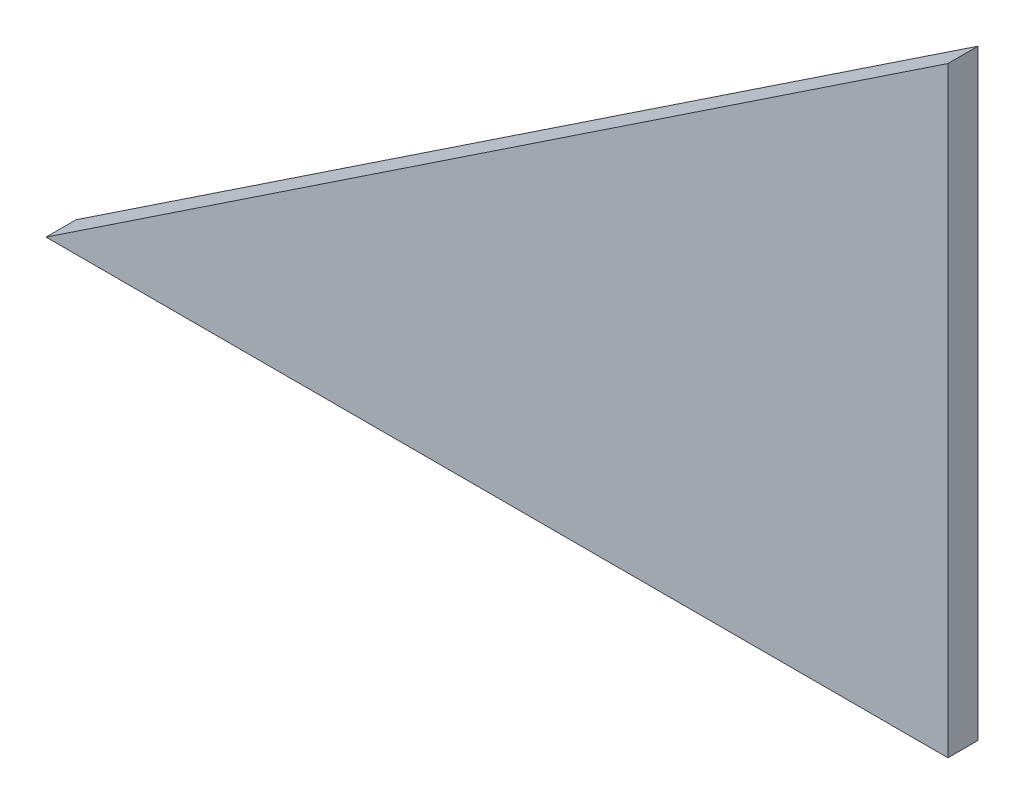
ISO-10303-21;
HEADER;
FILE_DESCRIPTION(('STEP AP214'),'2;1');
FILE_NAME('part.step','',(''),(''),'','','');
FILE_SCHEMA(('AUTOMOTIVE_DESIGN { 1 0 10303 214 1 1 1 1 }'));
ENDSEC;
DATA;
#1=APPLICATION_CONTEXT('core data for automotive mechanical design processes');
#2=APPLICATION_PROTOCOL_DEFINITION('international standard','automotive_design',2000,#1);
#3=PRODUCT_CONTEXT('',#1,'mechanical');
#4=PRODUCT('Part','Part','',(#3));
#5=PRODUCT_RELATED_PRODUCT_CATEGORY('part','',(#4));
#6=PRODUCT_DEFINITION_FORMATION('','',#4);
#7=PRODUCT_DEFINITION_CONTEXT('part definition',#1,'design');
#8=PRODUCT_DEFINITION('design','',#6,#7);
#9=PRODUCT_DEFINITION_SHAPE('','',#8);
#10=(LENGTH_UNIT() NAMED_UNIT(*) SI_UNIT(.MILLI.,.METRE.));
#11=(NAMED_UNIT(*) PLANE_ANGLE_UNIT() SI_UNIT($,.RADIAN.));
#12=(NAMED_UNIT(*) SI_UNIT($,.STERADIAN.) SOLID_ANGLE_UNIT());
#13=UNCERTAINTY_MEASURE_WITH_UNIT(LENGTH_MEASURE(1.E-05),#10,'distance_accuracy_value','');
#14=(GEOMETRIC_REPRESENTATION_CONTEXT(3) GLOBAL_UNCERTAINTY_ASSIGNED_CONTEXT((#13)) GLOBAL_UNIT_ASSIGNED_CONTEXT((#10,
#11,#12)) REPRESENTATION_CONTEXT('',''));
#15=CARTESIAN_POINT('',(0.,0.,0.));
#16=DIRECTION('',(0.,0.,1.));
#17=DIRECTION('',(1.,0.,0.));
#18=AXIS2_PLACEMENT_3D('',#15,#16,#17);
#19=CARTESIAN_POINT('',(196.936631061405,11.9600810738256,22.4064867546874));
#20=DIRECTION('',(0.,1.,0.));
#21=DIRECTION('',(0.,0.,1.));
#22=AXIS2_PLACEMENT_3D('',#19,#20,#21);
#23=PLANE('',#22);
#24=DIRECTION('',(-1.,0.,0.));
#25=VECTOR('',#24,1.);
#26=CARTESIAN_POINT('',(196.936631061405,11.9600810738256,23.6764867546873));
#27=LINE('',#26,#25);
#28=CARTESIAN_POINT('',(235.036631061405,11.9600810738256,23.6764867546873));
#29=VERTEX_POINT('',#28);
#30=CARTESIAN_POINT('',(196.936631061405,11.9600810738256,23.6764867546873));
#31=VERTEX_POINT('',#30);
#32=EDGE_CURVE('E80',#29,#31,#27,.T.);
#33=ORIENTED_EDGE('',*,*,#32,.T.);
#34=DIRECTION('',(0.,0.,1.));
#35=VECTOR('',#34,1.);
#36=CARTESIAN_POINT('',(196.936631061405,11.9600810738256,22.4064867546874));
#37=LINE('',#36,#35);
#38=CARTESIAN_POINT('',(196.936631061405,11.9600810738256,22.4064867546874));
#39=VERTEX_POINT('',#38);
#40=EDGE_CURVE('E11',#39,#31,#37,.T.);
#41=ORIENTED_EDGE('',*,*,#40,.F.);
#42=DIRECTION('',(-1.,0.,0.));
#43=VECTOR('',#42,1.);
#44=CARTESIAN_POINT('',(196.936631061405,11.9600810738256,22.4064867546874));
#45=LINE('',#44,#43);
#46=CARTESIAN_POINT('',(235.036631061405,11.9600810738256,22.4064867546874));
#47=VERTEX_POINT('',#46);
#48=EDGE_CURVE('E73',#47,#39,#45,.T.);
#49=ORIENTED_EDGE('',*,*,#48,.F.);
#50=DIRECTION('',(0.,0.,1.));
#51=VECTOR('',#50,1.);
#52=CARTESIAN_POINT('',(235.036631061405,11.9600810738256,22.4064867546874));
#53=LINE('',#52,#51);
#54=EDGE_CURVE('E81',#47,#29,#53,.T.);
#55=ORIENTED_EDGE('',*,*,#54,.T.);
#56=EDGE_LOOP('',(#33,#41,#49,#55));
#57=FACE_BOUND('',#56,.T.);
#58=ADVANCED_FACE('F33',(#57),#23,.F.);
#59=CARTESIAN_POINT('',(235.036631061405,37.3600810738256,22.4064867546874));
#60=DIRECTION('',(0.554700196225229,-0.832050294337844,0.));
#61=DIRECTION('',(0.832050294337844,0.554700196225229,0.));
#62=AXIS2_PLACEMENT_3D('',#59,#60,#61);
#63=PLANE('',#62);
#64=DIRECTION('',(0.832050294337844,0.554700196225229,0.));
#65=VECTOR('',#64,1.);
#66=CARTESIAN_POINT('',(235.036631061405,37.3600810738256,23.6764867546874));
#67=LINE('',#66,#65);
#68=CARTESIAN_POINT('',(235.036631061405,37.3600810738256,23.6764867546874));
#69=VERTEX_POINT('',#68);
#70=EDGE_CURVE('E61',#31,#69,#67,.T.);
#71=ORIENTED_EDGE('',*,*,#70,.T.);
#72=DIRECTION('',(0.,0.,1.));
#73=VECTOR('',#72,1.);
#74=CARTESIAN_POINT('',(235.036631061405,37.3600810738256,22.4064867546874));
#75=LINE('',#74,#73);
#76=CARTESIAN_POINT('',(235.036631061405,37.3600810738256,22.4064867546874));
#77=VERTEX_POINT('',#76);
#78=EDGE_CURVE('E41',#77,#69,#75,.T.);
#79=ORIENTED_EDGE('',*,*,#78,.F.);
#80=DIRECTION('',(0.832050294337844,0.554700196225229,0.));
#81=VECTOR('',#80,1.);
#82=CARTESIAN_POINT('',(235.036631061405,37.3600810738256,22.4064867546874));
#83=LINE('',#82,#81);
#84=EDGE_CURVE('E69',#39,#77,#83,.T.);
#85=ORIENTED_EDGE('',*,*,#84,.F.);
#86=ORIENTED_EDGE('',*,*,#40,.T.);
#87=EDGE_LOOP('',(#71,#79,#85,#86));
#88=FACE_BOUND('',#87,.T.);
#89=ADVANCED_FACE('F70',(#88),#63,.F.);
#90=CARTESIAN_POINT('',(235.036631061405,11.9600810738256,22.4064867546874));
#91=DIRECTION('',(-1.,0.,0.));
#92=DIRECTION('',(0.,0.,1.));
#93=AXIS2_PLACEMENT_3D('',#90,#91,#92);
#94=PLANE('',#93);
#95=DIRECTION('',(0.,-1.,0.));
#96=VECTOR('',#95,1.);
#97=CARTESIAN_POINT('',(235.036631061405,11.9600810738256,23.6764867546873));
#98=LINE('',#97,#96);
#99=EDGE_CURVE('E66',#69,#29,#98,.T.);
#100=ORIENTED_EDGE('',*,*,#99,.T.);
#101=ORIENTED_EDGE('',*,*,#54,.F.);
#102=DIRECTION('',(0.,-1.,0.));
#103=VECTOR('',#102,1.);
#104=CARTESIAN_POINT('',(235.036631061405,11.9600810738256,22.4064867546874));
#105=LINE('',#104,#103);
#106=EDGE_CURVE('E49',#77,#47,#105,.T.);
#107=ORIENTED_EDGE('',*,*,#106,.F.);
#108=ORIENTED_EDGE('',*,*,#78,.T.);
#109=EDGE_LOOP('',(#100,#101,#107,#108));
#110=FACE_BOUND('',#109,.T.);
#111=ADVANCED_FACE('F88',(#110),#94,.F.);
#112=CARTESIAN_POINT('',(0.,0.,22.4064867546874));
#113=DIRECTION('',(0.,0.,1.));
#114=DIRECTION('',(0.,-1.,0.));
#115=AXIS2_PLACEMENT_3D('',#112,#113,#114);
#116=PLANE('',#115);
#117=ORIENTED_EDGE('',*,*,#48,.T.);
#118=ORIENTED_EDGE('',*,*,#84,.T.);
#119=ORIENTED_EDGE('',*,*,#106,.T.);
#120=EDGE_LOOP('',(#117,#118,#119));
#121=FACE_BOUND('',#120,.T.);
#122=ADVANCED_FACE('F76',(#121),#116,.F.);
#123=CARTESIAN_POINT('',(0.,0.,23.6764867546873));
#124=DIRECTION('',(0.,0.,1.));
#125=DIRECTION('',(0.,-1.,0.));
#126=AXIS2_PLACEMENT_3D('',#123,#124,#125);
#127=PLANE('',#126);
#128=ORIENTED_EDGE('',*,*,#32,.F.);
#129=ORIENTED_EDGE('',*,*,#99,.F.);
#130=ORIENTED_EDGE('',*,*,#70,.F.);
#131=EDGE_LOOP('',(#128,#129,#130));
#132=FACE_BOUND('',#131,.T.);
#133=ADVANCED_FACE('F89',(#132),#127,.T.);
#134=CLOSED_SHELL('',(#58,#89,#111,#122,#133));
#135=MANIFOLD_SOLID_BREP('B2',#134);
#136=ADVANCED_BREP_SHAPE_REPRESENTATION('',(#18,#135),#14);
#137=SHAPE_DEFINITION_REPRESENTATION(#9,#136);
ENDSEC;
END-ISO-10303-21;
